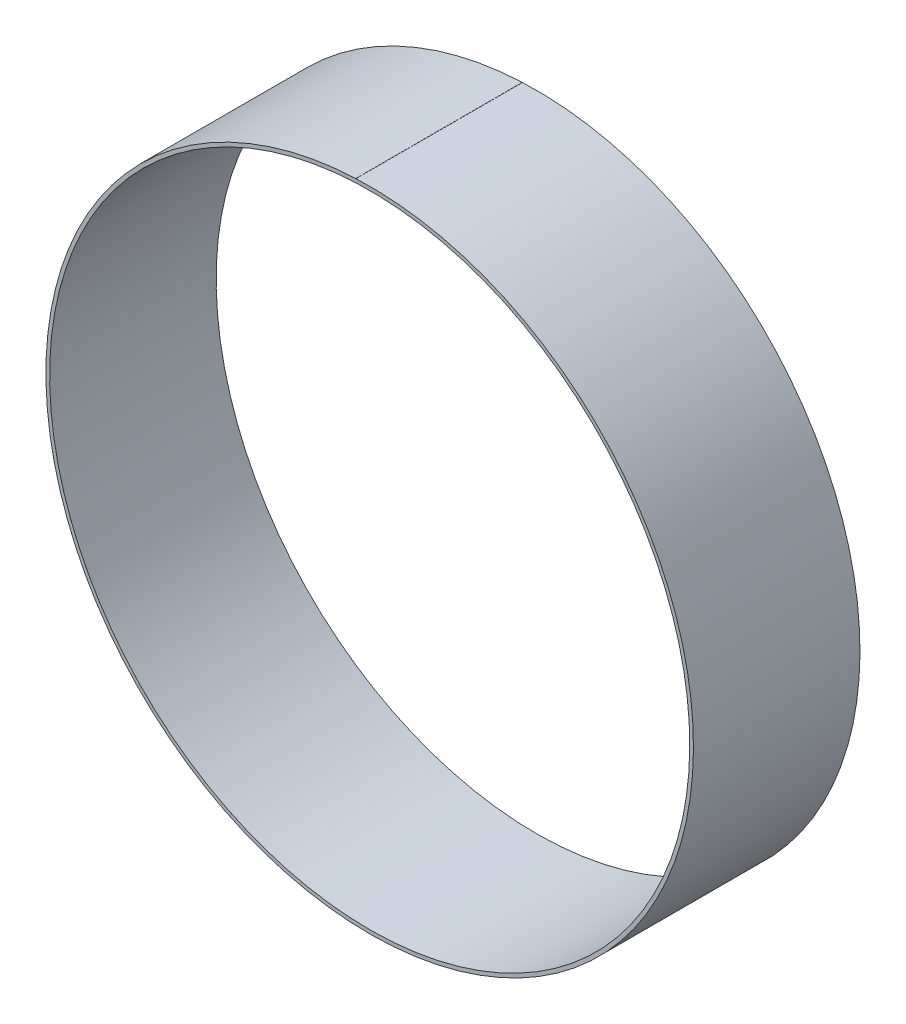
ISO-10303-21;
HEADER;
FILE_DESCRIPTION(('STEP AP214'),'2;1');
FILE_NAME('part.step','',(''),(''),'','','');
FILE_SCHEMA(('AUTOMOTIVE_DESIGN { 1 0 10303 214 1 1 1 1 }'));
ENDSEC;
DATA;
#1=APPLICATION_CONTEXT('core data for automotive mechanical design processes');
#2=APPLICATION_PROTOCOL_DEFINITION('international standard','automotive_design',2000,#1);
#3=PRODUCT_CONTEXT('',#1,'mechanical');
#4=PRODUCT('Part','Part','',(#3));
#5=PRODUCT_RELATED_PRODUCT_CATEGORY('part','',(#4));
#6=PRODUCT_DEFINITION_FORMATION('','',#4);
#7=PRODUCT_DEFINITION_CONTEXT('part definition',#1,'design');
#8=PRODUCT_DEFINITION('design','',#6,#7);
#9=PRODUCT_DEFINITION_SHAPE('','',#8);
#10=(LENGTH_UNIT() NAMED_UNIT(*) SI_UNIT(.MILLI.,.METRE.));
#11=(NAMED_UNIT(*) PLANE_ANGLE_UNIT() SI_UNIT($,.RADIAN.));
#12=(NAMED_UNIT(*) SI_UNIT($,.STERADIAN.) SOLID_ANGLE_UNIT());
#13=UNCERTAINTY_MEASURE_WITH_UNIT(LENGTH_MEASURE(1.E-05),#10,'distance_accuracy_value','');
#14=(GEOMETRIC_REPRESENTATION_CONTEXT(3) GLOBAL_UNCERTAINTY_ASSIGNED_CONTEXT((#13)) GLOBAL_UNIT_ASSIGNED_CONTEXT((#10,
#11,#12)) REPRESENTATION_CONTEXT('',''));
#15=CARTESIAN_POINT('',(0.,0.,0.));
#16=DIRECTION('',(0.,0.,1.));
#17=DIRECTION('',(1.,0.,0.));
#18=AXIS2_PLACEMENT_3D('',#15,#16,#17);
#19=CARTESIAN_POINT('',(0.,0.,10.));
#20=DIRECTION('',(0.,0.,-1.));
#21=DIRECTION('',(-1.,0.,0.));
#22=AXIS2_PLACEMENT_3D('',#19,#20,#21);
#23=CYLINDRICAL_SURFACE('',#22,175.);
#24=DIRECTION('',(0.,0.,-1.));
#25=VECTOR('',#24,1.);
#26=CARTESIAN_POINT('',(-7.53994638221791,174.83749371503,10.));
#27=LINE('',#26,#25);
#28=CARTESIAN_POINT('',(-7.53994638221791,174.83749371503,10.));
#29=VERTEX_POINT('',#28);
#30=CARTESIAN_POINT('',(-7.53994638221791,174.83749371503,-80.));
#31=VERTEX_POINT('',#30);
#32=EDGE_CURVE('E62',#29,#31,#27,.T.);
#33=ORIENTED_EDGE('',*,*,#32,.T.);
#34=CARTESIAN_POINT('',(0.,0.,-80.));
#35=DIRECTION('',(0.,0.,1.));
#36=DIRECTION('',(1.,0.,0.));
#37=AXIS2_PLACEMENT_3D('',#34,#35,#36);
#38=CIRCLE('',#37,175.);
#39=CARTESIAN_POINT('',(-7.43879031285368,174.841826799772,-80.));
#40=VERTEX_POINT('',#39);
#41=EDGE_CURVE('E102',#31,#40,#38,.T.);
#42=ORIENTED_EDGE('',*,*,#41,.T.);
#43=DIRECTION('',(0.,0.,-1.));
#44=VECTOR('',#43,1.);
#45=CARTESIAN_POINT('',(-7.43879031285368,174.841826799772,10.));
#46=LINE('',#45,#44);
#47=CARTESIAN_POINT('',(-7.43879031285368,174.841826799772,10.));
#48=VERTEX_POINT('',#47);
#49=EDGE_CURVE('E13',#48,#40,#46,.T.);
#50=ORIENTED_EDGE('',*,*,#49,.F.);
#51=CARTESIAN_POINT('',(0.,0.,10.));
#52=DIRECTION('',(0.,0.,1.));
#53=DIRECTION('',(1.,0.,0.));
#54=AXIS2_PLACEMENT_3D('',#51,#52,#53);
#55=CIRCLE('',#54,175.);
#56=EDGE_CURVE('E110',#29,#48,#55,.T.);
#57=ORIENTED_EDGE('',*,*,#56,.F.);
#58=EDGE_LOOP('',(#33,#42,#50,#57));
#59=FACE_BOUND('',#58,.T.);
#60=ADVANCED_FACE('F48',(#59),#23,.T.);
#61=CARTESIAN_POINT('',(-7.35377556642107,172.843634493489,10.));
#62=DIRECTION('',(-0.999096153141553,-0.0425073732163063,0.));
#63=DIRECTION('',(0.0425073732163063,-0.999096153141553,0.));
#64=AXIS2_PLACEMENT_3D('',#61,#62,#63);
#65=PLANE('',#64);
#66=ORIENTED_EDGE('',*,*,#49,.T.);
#67=DIRECTION('',(-0.0425073732163063,0.999096153141553,0.));
#68=VECTOR('',#67,1.);
#69=CARTESIAN_POINT('',(-7.35377556642107,172.843634493489,-80.));
#70=LINE('',#69,#68);
#71=CARTESIAN_POINT('',(-7.35377556642107,172.843634493489,-80.));
#72=VERTEX_POINT('',#71);
#73=EDGE_CURVE('E92',#72,#40,#70,.T.);
#74=ORIENTED_EDGE('',*,*,#73,.F.);
#75=DIRECTION('',(0.,0.,-1.));
#76=VECTOR('',#75,1.);
#77=CARTESIAN_POINT('',(-7.35377556642107,172.843634493489,10.));
#78=LINE('',#77,#76);
#79=CARTESIAN_POINT('',(-7.35377556642107,172.843634493489,10.));
#80=VERTEX_POINT('',#79);
#81=EDGE_CURVE('E55',#80,#72,#78,.T.);
#82=ORIENTED_EDGE('',*,*,#81,.F.);
#83=DIRECTION('',(-0.0425073732163063,0.999096153141553,0.));
#84=VECTOR('',#83,1.);
#85=CARTESIAN_POINT('',(-7.35377556642107,172.843634493489,10.));
#86=LINE('',#85,#84);
#87=EDGE_CURVE('E94',#80,#48,#86,.T.);
#88=ORIENTED_EDGE('',*,*,#87,.T.);
#89=EDGE_LOOP('',(#66,#74,#82,#88));
#90=FACE_BOUND('',#89,.T.);
#91=ADVANCED_FACE('F91',(#90),#65,.T.);
#92=CARTESIAN_POINT('',(0.,0.,10.));
#93=DIRECTION('',(0.,0.,-1.));
#94=DIRECTION('',(-1.,0.,0.));
#95=AXIS2_PLACEMENT_3D('',#92,#93,#94);
#96=CYLINDRICAL_SURFACE('',#95,173.);
#97=ORIENTED_EDGE('',*,*,#81,.T.);
#98=CARTESIAN_POINT('',(0.,0.,-80.));
#99=DIRECTION('',(0.,0.,1.));
#100=DIRECTION('',(1.,0.,0.));
#101=AXIS2_PLACEMENT_3D('',#98,#99,#100);
#102=CIRCLE('',#101,173.);
#103=CARTESIAN_POINT('',(-7.45377556642114,172.839350929716,-80.));
#104=VERTEX_POINT('',#103);
#105=EDGE_CURVE('E103',#104,#72,#102,.T.);
#106=ORIENTED_EDGE('',*,*,#105,.F.);
#107=DIRECTION('',(0.,0.,-1.));
#108=VECTOR('',#107,1.);
#109=CARTESIAN_POINT('',(-7.45377556642114,172.839350929716,10.));
#110=LINE('',#109,#108);
#111=CARTESIAN_POINT('',(-7.45377556642114,172.839350929716,10.));
#112=VERTEX_POINT('',#111);
#113=EDGE_CURVE('E70',#112,#104,#110,.T.);
#114=ORIENTED_EDGE('',*,*,#113,.F.);
#115=CARTESIAN_POINT('',(0.,0.,10.));
#116=DIRECTION('',(0.,0.,1.));
#117=DIRECTION('',(1.,0.,0.));
#118=AXIS2_PLACEMENT_3D('',#115,#116,#117);
#119=CIRCLE('',#118,173.);
#120=EDGE_CURVE('E113',#112,#80,#119,.T.);
#121=ORIENTED_EDGE('',*,*,#120,.T.);
#122=EDGE_LOOP('',(#97,#106,#114,#121));
#123=FACE_BOUND('',#122,.T.);
#124=ADVANCED_FACE('F118',(#123),#96,.F.);
#125=CARTESIAN_POINT('',(-7.53994638221791,174.83749371503,10.));
#126=DIRECTION('',(0.999071392657316,0.0430854078983884,0.));
#127=DIRECTION('',(-0.0430854078983884,0.999071392657316,0.));
#128=AXIS2_PLACEMENT_3D('',#125,#126,#127);
#129=PLANE('',#128);
#130=ORIENTED_EDGE('',*,*,#113,.T.);
#131=DIRECTION('',(0.0430854078983884,-0.999071392657316,0.));
#132=VECTOR('',#131,1.);
#133=CARTESIAN_POINT('',(-7.53994638221791,174.83749371503,-80.));
#134=LINE('',#133,#132);
#135=EDGE_CURVE('E108',#31,#104,#134,.T.);
#136=ORIENTED_EDGE('',*,*,#135,.F.);
#137=ORIENTED_EDGE('',*,*,#32,.F.);
#138=DIRECTION('',(0.0430854078983884,-0.999071392657316,0.));
#139=VECTOR('',#138,1.);
#140=CARTESIAN_POINT('',(-7.53994638221791,174.83749371503,10.));
#141=LINE('',#140,#139);
#142=EDGE_CURVE('E115',#29,#112,#141,.T.);
#143=ORIENTED_EDGE('',*,*,#142,.T.);
#144=EDGE_LOOP('',(#130,#136,#137,#143));
#145=FACE_BOUND('',#144,.T.);
#146=ADVANCED_FACE('F122',(#145),#129,.T.);
#147=CARTESIAN_POINT('',(0.,0.,10.));
#148=DIRECTION('',(0.,0.,1.));
#149=DIRECTION('',(1.,0.,0.));
#150=AXIS2_PLACEMENT_3D('',#147,#148,#149);
#151=PLANE('',#150);
#152=ORIENTED_EDGE('',*,*,#56,.T.);
#153=ORIENTED_EDGE('',*,*,#87,.F.);
#154=ORIENTED_EDGE('',*,*,#120,.F.);
#155=ORIENTED_EDGE('',*,*,#142,.F.);
#156=EDGE_LOOP('',(#152,#153,#154,#155));
#157=FACE_BOUND('',#156,.T.);
#158=ADVANCED_FACE('F120',(#157),#151,.T.);
#159=CARTESIAN_POINT('',(0.,0.,-80.));
#160=DIRECTION('',(0.,0.,1.));
#161=DIRECTION('',(1.,0.,0.));
#162=AXIS2_PLACEMENT_3D('',#159,#160,#161);
#163=PLANE('',#162);
#164=ORIENTED_EDGE('',*,*,#41,.F.);
#165=ORIENTED_EDGE('',*,*,#135,.T.);
#166=ORIENTED_EDGE('',*,*,#105,.T.);
#167=ORIENTED_EDGE('',*,*,#73,.T.);
#168=EDGE_LOOP('',(#164,#165,#166,#167));
#169=FACE_BOUND('',#168,.T.);
#170=ADVANCED_FACE('F100',(#169),#163,.F.);
#171=CLOSED_SHELL('',(#60,#91,#124,#146,#158,#170));
#172=MANIFOLD_SOLID_BREP('B2',#171);
#173=ADVANCED_BREP_SHAPE_REPRESENTATION('',(#18,#172),#14);
#174=SHAPE_DEFINITION_REPRESENTATION(#9,#173);
ENDSEC;
END-ISO-10303-21;
